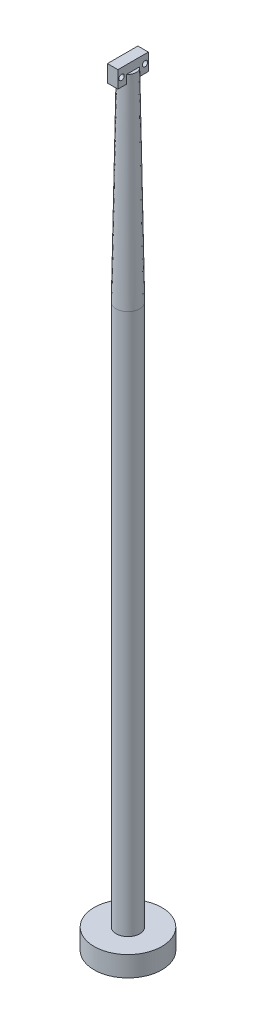
ISO-10303-21;
HEADER;
FILE_DESCRIPTION(('STEP AP214'),'2;1');
FILE_NAME('part.step','',(''),(''),'','','');
FILE_SCHEMA(('AUTOMOTIVE_DESIGN { 1 0 10303 214 1 1 1 1 }'));
ENDSEC;
DATA;
#1=APPLICATION_CONTEXT('core data for automotive mechanical design processes');
#2=APPLICATION_PROTOCOL_DEFINITION('international standard','automotive_design',2000,#1);
#3=PRODUCT_CONTEXT('',#1,'mechanical');
#4=PRODUCT('Part','Part','',(#3));
#5=PRODUCT_RELATED_PRODUCT_CATEGORY('part','',(#4));
#6=PRODUCT_DEFINITION_FORMATION('','',#4);
#7=PRODUCT_DEFINITION_CONTEXT('part definition',#1,'design');
#8=PRODUCT_DEFINITION('design','',#6,#7);
#9=PRODUCT_DEFINITION_SHAPE('','',#8);
#10=(LENGTH_UNIT() NAMED_UNIT(*) SI_UNIT(.MILLI.,.METRE.));
#11=(NAMED_UNIT(*) PLANE_ANGLE_UNIT() SI_UNIT($,.RADIAN.));
#12=(NAMED_UNIT(*) SI_UNIT($,.STERADIAN.) SOLID_ANGLE_UNIT());
#13=UNCERTAINTY_MEASURE_WITH_UNIT(LENGTH_MEASURE(1.E-05),#10,'distance_accuracy_value','');
#14=(GEOMETRIC_REPRESENTATION_CONTEXT(3) GLOBAL_UNCERTAINTY_ASSIGNED_CONTEXT((#13)) GLOBAL_UNIT_ASSIGNED_CONTEXT((#10,
#11,#12)) REPRESENTATION_CONTEXT('',''));
#15=CARTESIAN_POINT('',(0.,0.,0.));
#16=DIRECTION('',(0.,0.,1.));
#17=DIRECTION('',(1.,0.,0.));
#18=AXIS2_PLACEMENT_3D('',#15,#16,#17);
#19=CARTESIAN_POINT('',(0.,11300.,0.));
#20=DIRECTION('',(0.,1.,0.));
#21=DIRECTION('',(0.,0.,1.));
#22=AXIS2_PLACEMENT_3D('',#19,#20,#21);
#23=PLANE('',#22);
#24=CARTESIAN_POINT('',(0.,11300.,0.));
#25=DIRECTION('',(0.,1.,0.));
#26=DIRECTION('',(0.,0.,1.));
#27=AXIS2_PLACEMENT_3D('',#24,#25,#26);
#28=CIRCLE('',#27,122.634805215347);
#29=CARTESIAN_POINT('',(-79.,11300.,-93.7992294755459));
#30=VERTEX_POINT('',#29);
#31=CARTESIAN_POINT('',(-79.,11300.,93.7992294755459));
#32=VERTEX_POINT('',#31);
#33=EDGE_CURVE('E198',#30,#32,#28,.T.);
#34=ORIENTED_EDGE('',*,*,#33,.T.);
#35=DIRECTION('',(0.,0.,-1.));
#36=VECTOR('',#35,1.);
#37=CARTESIAN_POINT('',(-79.,11300.,0.));
#38=LINE('',#37,#36);
#39=EDGE_CURVE('E212',#32,#30,#38,.T.);
#40=ORIENTED_EDGE('',*,*,#39,.T.);
#41=EDGE_LOOP('',(#34,#40));
#42=FACE_BOUND('',#41,.T.);
#43=ADVANCED_FACE('F32',(#42),#23,.T.);
#44=CARTESIAN_POINT('',(0.,300.,0.));
#45=DIRECTION('',(0.,-1.,0.));
#46=DIRECTION('',(0.,0.,-1.));
#47=AXIS2_PLACEMENT_3D('',#44,#45,#46);
#48=CYLINDRICAL_SURFACE('',#47,500.);
#49=CARTESIAN_POINT('',(0.,300.,0.));
#50=DIRECTION('',(0.,1.,0.));
#51=DIRECTION('',(0.,0.,1.));
#52=AXIS2_PLACEMENT_3D('',#49,#50,#51);
#53=CIRCLE('',#52,500.);
#54=CARTESIAN_POINT('',(0.,300.,500.));
#55=VERTEX_POINT('',#54);
#56=EDGE_CURVE('E209',#55,#55,#53,.T.);
#57=ORIENTED_EDGE('',*,*,#56,.F.);
#58=EDGE_LOOP('',(#57));
#59=FACE_BOUND('',#58,.T.);
#60=CARTESIAN_POINT('',(0.,0.,0.));
#61=DIRECTION('',(0.,1.,0.));
#62=DIRECTION('',(0.,0.,1.));
#63=AXIS2_PLACEMENT_3D('',#60,#61,#62);
#64=CIRCLE('',#63,500.);
#65=CARTESIAN_POINT('',(0.,0.,500.));
#66=VERTEX_POINT('',#65);
#67=EDGE_CURVE('E206',#66,#66,#64,.T.);
#68=ORIENTED_EDGE('',*,*,#67,.T.);
#69=EDGE_LOOP('',(#68));
#70=FACE_BOUND('',#69,.T.);
#71=ADVANCED_FACE('F34',(#59,#70),#48,.T.);
#72=CARTESIAN_POINT('',(0.,300.,0.));
#73=DIRECTION('',(0.,1.,0.));
#74=DIRECTION('',(0.,0.,1.));
#75=AXIS2_PLACEMENT_3D('',#72,#73,#74);
#76=PLANE('',#75);
#77=CARTESIAN_POINT('',(0.,300.,0.));
#78=DIRECTION('',(0.,1.,0.));
#79=DIRECTION('',(0.,0.,1.));
#80=AXIS2_PLACEMENT_3D('',#77,#78,#79);
#81=CIRCLE('',#80,175.);
#82=CARTESIAN_POINT('',(0.,300.,175.));
#83=VERTEX_POINT('',#82);
#84=EDGE_CURVE('E202',#83,#83,#81,.T.);
#85=ORIENTED_EDGE('',*,*,#84,.F.);
#86=EDGE_LOOP('',(#85));
#87=FACE_BOUND('',#86,.T.);
#88=ORIENTED_EDGE('',*,*,#56,.T.);
#89=EDGE_LOOP('',(#88));
#90=FACE_BOUND('',#89,.T.);
#91=ADVANCED_FACE('F239',(#87,#90),#76,.T.);
#92=CARTESIAN_POINT('',(0.,0.,0.));
#93=DIRECTION('',(0.,1.,0.));
#94=DIRECTION('',(0.,0.,1.));
#95=AXIS2_PLACEMENT_3D('',#92,#93,#94);
#96=PLANE('',#95);
#97=ORIENTED_EDGE('',*,*,#67,.F.);
#98=EDGE_LOOP('',(#97));
#99=FACE_BOUND('',#98,.T.);
#100=ADVANCED_FACE('F253',(#99),#96,.F.);
#101=CARTESIAN_POINT('',(0.,8300.,0.));
#102=DIRECTION('',(0.,-1.,0.));
#103=DIRECTION('',(0.,0.,-1.));
#104=AXIS2_PLACEMENT_3D('',#101,#102,#103);
#105=CYLINDRICAL_SURFACE('',#104,175.);
#106=CARTESIAN_POINT('',(0.,8300.,0.));
#107=DIRECTION('',(0.,1.,0.));
#108=DIRECTION('',(0.,0.,1.));
#109=AXIS2_PLACEMENT_3D('',#106,#107,#108);
#110=CIRCLE('',#109,175.);
#111=CARTESIAN_POINT('',(0.,8300.,175.));
#112=VERTEX_POINT('',#111);
#113=EDGE_CURVE('E203',#112,#112,#110,.T.);
#114=ORIENTED_EDGE('',*,*,#113,.F.);
#115=EDGE_LOOP('',(#114));
#116=FACE_BOUND('',#115,.T.);
#117=ORIENTED_EDGE('',*,*,#84,.T.);
#118=EDGE_LOOP('',(#117));
#119=FACE_BOUND('',#118,.T.);
#120=ADVANCED_FACE('F249',(#116,#119),#105,.T.);
#121=CARTESIAN_POINT('',(0.,8300.,0.));
#122=DIRECTION('',(0.,-1.,0.));
#123=DIRECTION('',(0.,0.,1.));
#124=AXIS2_PLACEMENT_3D('',#121,#122,#123);
#125=CONICAL_SURFACE('',#124,175.,0.0174532925199434);
#126=CARTESIAN_POINT('',(0.,11175.,0.));
#127=DIRECTION('',(0.,-1.,0.));
#128=DIRECTION('',(0.,0.,-1.));
#129=AXIS2_PLACEMENT_3D('',#126,#127,#128);
#130=CIRCLE('',#129,124.816688331374);
#131=CARTESIAN_POINT('',(-79.,11175.,-96.6343918385797));
#132=VERTEX_POINT('',#131);
#133=CARTESIAN_POINT('',(76.,11175.,-99.0111392016605));
#134=VERTEX_POINT('',#133);
#135=EDGE_CURVE('E11',#132,#134,#130,.T.);
#136=ORIENTED_EDGE('',*,*,#135,.T.);
#137=CARTESIAN_POINT('',(76.,10961.3450010045,-103.672981170937));
#138=CARTESIAN_POINT('',(76.,11002.0524482871,-102.791943214282));
#139=CARTESIAN_POINT('',(76.,11042.7598113228,-101.907006159478));
#140=CARTESIAN_POINT('',(76.,11124.1743498459,-100.128642942186));
#141=CARTESIAN_POINT('',(76.,11164.8815253334,-99.2352167801339));
#142=CARTESIAN_POINT('',(76.,11246.295674207,-97.439184339552));
#143=CARTESIAN_POINT('',(76.,11287.002647593,-96.536578060951));
#144=CARTESIAN_POINT('',(76.,11368.4163732934,-94.7213578878458));
#145=CARTESIAN_POINT('',(76.,11409.1231256078,-93.8087439928269));
#146=CARTESIAN_POINT('',(76.,11449.8297559654,-92.8907125828367));
#147=B_SPLINE_CURVE_WITH_KNOTS('',3,(#137,#138,#139,#140,#141,#142,#143,#144,#145,#146),
.UNSPECIFIED.,.F.,.F.,(4,2,2,2,4),(0.,122.150941188795,244.301876097274,366.452811951517,
488.603754087766),.UNSPECIFIED.);
#148=CARTESIAN_POINT('',(76.,11300.,-96.2460152432615));
#149=VERTEX_POINT('',#148);
#150=EDGE_CURVE('E193',#134,#149,#147,.T.);
#151=ORIENTED_EDGE('',*,*,#150,.T.);
#152=CARTESIAN_POINT('',(76.,11300.,96.2460152432615));
#153=VERTEX_POINT('',#152);
#154=EDGE_CURVE('E199',#153,#149,#28,.T.);
#155=ORIENTED_EDGE('',*,*,#154,.F.);
#156=CARTESIAN_POINT('',(76.,11449.8297559654,92.8907125828367));
#157=CARTESIAN_POINT('',(76.,11409.1231256078,93.8087439928269));
#158=CARTESIAN_POINT('',(76.,11368.4163732934,94.7213578878458));
#159=CARTESIAN_POINT('',(76.,11287.002647593,96.5365780609509));
#160=CARTESIAN_POINT('',(76.,11246.295674207,97.4391843395519));
#161=CARTESIAN_POINT('',(76.,11164.8815253334,99.2352167801339));
#162=CARTESIAN_POINT('',(76.,11124.1743498459,100.128642942186));
#163=CARTESIAN_POINT('',(76.,11042.7598113228,101.907006159478));
#164=CARTESIAN_POINT('',(76.,11002.0524482871,102.791943214282));
#165=CARTESIAN_POINT('',(76.,10961.3450010045,103.672981170937));
#166=B_SPLINE_CURVE_WITH_KNOTS('',3,(#156,#157,#158,#159,#160,#161,#162,#163,#164,#165),
.UNSPECIFIED.,.F.,.F.,(4,2,2,2,4),(0.,122.150942136249,244.30187799049,366.452812898971,
488.603754087766),.UNSPECIFIED.);
#167=CARTESIAN_POINT('',(76.,11175.,99.0111392016606));
#168=VERTEX_POINT('',#167);
#169=EDGE_CURVE('E188',#153,#168,#166,.T.);
#170=ORIENTED_EDGE('',*,*,#169,.T.);
#171=CARTESIAN_POINT('',(-79.,11175.,96.6343918385797));
#172=VERTEX_POINT('',#171);
#173=EDGE_CURVE('E36',#168,#172,#130,.T.);
#174=ORIENTED_EDGE('',*,*,#173,.T.);
#175=CARTESIAN_POINT('',(-79.,11449.773776938,90.3544079248871));
#176=CARTESIAN_POINT('',(-79.,11409.0674225103,91.2982052061098));
#177=CARTESIAN_POINT('',(-79.,11368.3609210498,92.2356471863578));
#178=CARTESIAN_POINT('',(-79.,11286.9476532916,94.0988370728721));
#179=CARTESIAN_POINT('',(-79.,11246.2408869938,95.0245849799531));
#180=CARTESIAN_POINT('',(-79.,11164.8271135668,96.8654033691673));
#181=CARTESIAN_POINT('',(-79.,11124.1201064375,97.7804738514183));
#182=CARTESIAN_POINT('',(-79.,11042.7058693609,99.6007775038031));
#183=CARTESIAN_POINT('',(-79.,11001.9986394135,100.506010673252));
#184=CARTESIAN_POINT('',(-79.,10961.291310123,101.406745173891));
#185=B_SPLINE_CURVE_WITH_KNOTS('',3,(#175,#176,#177,#178,#179,#180,#181,#182,#183,#184),
.UNSPECIFIED.,.F.,.F.,(4,2,2,2,4),(0.,122.151881539936,244.303754570798,366.455626255967,
488.607506447586),.UNSPECIFIED.);
#186=EDGE_CURVE('E147',#32,#172,#185,.T.);
#187=ORIENTED_EDGE('',*,*,#186,.F.);
#188=ORIENTED_EDGE('',*,*,#33,.F.);
#189=CARTESIAN_POINT('',(-79.,10961.291310123,-101.406745173891));
#190=CARTESIAN_POINT('',(-79.,11001.9986394135,-100.506010673252));
#191=CARTESIAN_POINT('',(-79.,11042.7058693609,-99.6007775038031));
#192=CARTESIAN_POINT('',(-79.,11124.1201064375,-97.7804738514182));
#193=CARTESIAN_POINT('',(-79.,11164.8271135668,-96.8654033691673));
#194=CARTESIAN_POINT('',(-79.,11246.2408869938,-95.024584979953));
#195=CARTESIAN_POINT('',(-79.,11286.9476532916,-94.0988370728721));
#196=CARTESIAN_POINT('',(-79.,11368.3609210498,-92.2356471863578));
#197=CARTESIAN_POINT('',(-79.,11409.0674225103,-91.2982052061098));
#198=CARTESIAN_POINT('',(-79.,11449.773776938,-90.3544079248871));
#199=B_SPLINE_CURVE_WITH_KNOTS('',3,(#189,#190,#191,#192,#193,#194,#195,#196,#197,#198),
.UNSPECIFIED.,.F.,.F.,(4,2,2,2,4),(0.,122.151880191622,244.30375187679,366.45562490765,
488.607506447586),.UNSPECIFIED.);
#200=EDGE_CURVE('E47',#132,#30,#199,.T.);
#201=ORIENTED_EDGE('',*,*,#200,.F.);
#202=EDGE_LOOP('',(#136,#151,#155,#170,#174,#187,#188,#201));
#203=FACE_BOUND('',#202,.T.);
#204=ORIENTED_EDGE('',*,*,#113,.T.);
#205=EDGE_LOOP('',(#204));
#206=FACE_BOUND('',#205,.T.);
#207=ADVANCED_FACE('F162',(#203,#206),#125,.T.);
#208=DIRECTION('',(0.,0.,-1.));
#209=VECTOR('',#208,1.);
#210=CARTESIAN_POINT('',(76.,11300.,0.));
#211=LINE('',#210,#209);
#212=EDGE_CURVE('E55',#153,#149,#211,.T.);
#213=ORIENTED_EDGE('',*,*,#212,.F.);
#214=ORIENTED_EDGE('',*,*,#154,.T.);
#215=EDGE_LOOP('',(#213,#214));
#216=FACE_BOUND('',#215,.T.);
#217=ADVANCED_FACE('F235',(#216),#23,.T.);
#218=CARTESIAN_POINT('',(76.,11175.,225.000000000001));
#219=DIRECTION('',(0.,-1.,0.));
#220=DIRECTION('',(0.,0.,-1.));
#221=AXIS2_PLACEMENT_3D('',#218,#219,#220);
#222=PLANE('',#221);
#223=ORIENTED_EDGE('',*,*,#173,.F.);
#224=DIRECTION('',(0.,0.,1.));
#225=VECTOR('',#224,1.);
#226=CARTESIAN_POINT('',(76.,11175.,225.000000000001));
#227=LINE('',#226,#225);
#228=CARTESIAN_POINT('',(76.,11175.,225.000000000001));
#229=VERTEX_POINT('',#228);
#230=EDGE_CURVE('E137',#168,#229,#227,.T.);
#231=ORIENTED_EDGE('',*,*,#230,.T.);
#232=DIRECTION('',(-1.,0.,0.));
#233=VECTOR('',#232,1.);
#234=CARTESIAN_POINT('',(76.,11175.,225.000000000001));
#235=LINE('',#234,#233);
#236=CARTESIAN_POINT('',(-79.,11175.,225.000000000001));
#237=VERTEX_POINT('',#236);
#238=EDGE_CURVE('E108',#229,#237,#235,.T.);
#239=ORIENTED_EDGE('',*,*,#238,.T.);
#240=DIRECTION('',(0.,0.,1.));
#241=VECTOR('',#240,1.);
#242=CARTESIAN_POINT('',(-79.,11175.,225.000000000001));
#243=LINE('',#242,#241);
#244=EDGE_CURVE('E114',#172,#237,#243,.T.);
#245=ORIENTED_EDGE('',*,*,#244,.F.);
#246=EDGE_LOOP('',(#223,#231,#239,#245));
#247=FACE_BOUND('',#246,.T.);
#248=ADVANCED_FACE('F183',(#247),#222,.T.);
#249=CARTESIAN_POINT('',(76.,0.,0.));
#250=DIRECTION('',(1.,0.,0.));
#251=DIRECTION('',(0.,0.,-1.));
#252=AXIS2_PLACEMENT_3D('',#249,#250,#251);
#253=PLANE('',#252);
#254=CARTESIAN_POINT('',(76.,11300.,-176.005281437028));
#255=DIRECTION('',(-1.,0.,0.));
#256=DIRECTION('',(0.,0.,1.));
#257=AXIS2_PLACEMENT_3D('',#254,#255,#256);
#258=CIRCLE('',#257,40.);
#259=CARTESIAN_POINT('',(76.,11300.,-136.005281437028));
#260=VERTEX_POINT('',#259);
#261=EDGE_CURVE('E133',#260,#260,#258,.T.);
#262=ORIENTED_EDGE('',*,*,#261,.T.);
#263=EDGE_LOOP('',(#262));
#264=FACE_BOUND('',#263,.T.);
#265=CARTESIAN_POINT('',(76.,11300.,171.372862680371));
#266=DIRECTION('',(-1.,0.,0.));
#267=DIRECTION('',(0.,0.,1.));
#268=AXIS2_PLACEMENT_3D('',#265,#266,#267);
#269=CIRCLE('',#268,40.);
#270=CARTESIAN_POINT('',(76.,11300.,211.372862680371));
#271=VERTEX_POINT('',#270);
#272=EDGE_CURVE('E130',#271,#271,#269,.T.);
#273=ORIENTED_EDGE('',*,*,#272,.T.);
#274=EDGE_LOOP('',(#273));
#275=FACE_BOUND('',#274,.T.);
#276=ORIENTED_EDGE('',*,*,#150,.F.);
#277=CARTESIAN_POINT('',(76.,11175.,-224.999999999999));
#278=VERTEX_POINT('',#277);
#279=EDGE_CURVE('E138',#278,#134,#227,.T.);
#280=ORIENTED_EDGE('',*,*,#279,.F.);
#281=DIRECTION('',(0.,-1.,0.));
#282=VECTOR('',#281,1.);
#283=CARTESIAN_POINT('',(76.,11425.,-224.999999999999));
#284=LINE('',#283,#282);
#285=CARTESIAN_POINT('',(76.,11425.,-224.999999999999));
#286=VERTEX_POINT('',#285);
#287=EDGE_CURVE('E104',#286,#278,#284,.T.);
#288=ORIENTED_EDGE('',*,*,#287,.F.);
#289=DIRECTION('',(0.,0.,-1.));
#290=VECTOR('',#289,1.);
#291=CARTESIAN_POINT('',(76.,11425.,225.000000000001));
#292=LINE('',#291,#290);
#293=CARTESIAN_POINT('',(76.,11425.,225.000000000001));
#294=VERTEX_POINT('',#293);
#295=EDGE_CURVE('E109',#294,#286,#292,.T.);
#296=ORIENTED_EDGE('',*,*,#295,.F.);
#297=DIRECTION('',(0.,1.,0.));
#298=VECTOR('',#297,1.);
#299=CARTESIAN_POINT('',(76.,11425.,225.000000000001));
#300=LINE('',#299,#298);
#301=EDGE_CURVE('E140',#229,#294,#300,.T.);
#302=ORIENTED_EDGE('',*,*,#301,.F.);
#303=ORIENTED_EDGE('',*,*,#230,.F.);
#304=ORIENTED_EDGE('',*,*,#169,.F.);
#305=ORIENTED_EDGE('',*,*,#212,.T.);
#306=EDGE_LOOP('',(#276,#280,#288,#296,#302,#303,#304,#305));
#307=FACE_BOUND('',#306,.T.);
#308=ADVANCED_FACE('F169',(#264,#275,#307),#253,.T.);
#309=CARTESIAN_POINT('',(-79.,0.,0.));
#310=DIRECTION('',(1.,0.,0.));
#311=DIRECTION('',(0.,0.,-1.));
#312=AXIS2_PLACEMENT_3D('',#309,#310,#311);
#313=PLANE('',#312);
#314=CARTESIAN_POINT('',(-79.,11300.,-176.005281437028));
#315=DIRECTION('',(-1.,0.,0.));
#316=DIRECTION('',(0.,0.,1.));
#317=AXIS2_PLACEMENT_3D('',#314,#315,#316);
#318=CIRCLE('',#317,40.);
#319=CARTESIAN_POINT('',(-79.,11300.,-136.005281437028));
#320=VERTEX_POINT('',#319);
#321=EDGE_CURVE('E121',#320,#320,#318,.T.);
#322=ORIENTED_EDGE('',*,*,#321,.F.);
#323=EDGE_LOOP('',(#322));
#324=FACE_BOUND('',#323,.T.);
#325=CARTESIAN_POINT('',(-79.,11300.,171.372862680371));
#326=DIRECTION('',(-1.,0.,0.));
#327=DIRECTION('',(0.,0.,1.));
#328=AXIS2_PLACEMENT_3D('',#325,#326,#327);
#329=CIRCLE('',#328,40.);
#330=CARTESIAN_POINT('',(-79.,11300.,211.372862680371));
#331=VERTEX_POINT('',#330);
#332=EDGE_CURVE('E124',#331,#331,#329,.T.);
#333=ORIENTED_EDGE('',*,*,#332,.F.);
#334=EDGE_LOOP('',(#333));
#335=FACE_BOUND('',#334,.T.);
#336=CARTESIAN_POINT('',(-79.,11175.,-224.999999999999));
#337=VERTEX_POINT('',#336);
#338=EDGE_CURVE('E111',#337,#132,#243,.T.);
#339=ORIENTED_EDGE('',*,*,#338,.T.);
#340=ORIENTED_EDGE('',*,*,#200,.T.);
#341=ORIENTED_EDGE('',*,*,#39,.F.);
#342=ORIENTED_EDGE('',*,*,#186,.T.);
#343=ORIENTED_EDGE('',*,*,#244,.T.);
#344=DIRECTION('',(0.,1.,0.));
#345=VECTOR('',#344,1.);
#346=CARTESIAN_POINT('',(-79.,11425.,225.000000000001));
#347=LINE('',#346,#345);
#348=CARTESIAN_POINT('',(-79.,11425.,225.000000000001));
#349=VERTEX_POINT('',#348);
#350=EDGE_CURVE('E113',#237,#349,#347,.T.);
#351=ORIENTED_EDGE('',*,*,#350,.T.);
#352=DIRECTION('',(0.,0.,-1.));
#353=VECTOR('',#352,1.);
#354=CARTESIAN_POINT('',(-79.,11425.,225.000000000001));
#355=LINE('',#354,#353);
#356=CARTESIAN_POINT('',(-79.,11425.,-224.999999999999));
#357=VERTEX_POINT('',#356);
#358=EDGE_CURVE('E120',#349,#357,#355,.T.);
#359=ORIENTED_EDGE('',*,*,#358,.T.);
#360=DIRECTION('',(0.,-1.,0.));
#361=VECTOR('',#360,1.);
#362=CARTESIAN_POINT('',(-79.,11425.,-224.999999999999));
#363=LINE('',#362,#361);
#364=EDGE_CURVE('E102',#357,#337,#363,.T.);
#365=ORIENTED_EDGE('',*,*,#364,.T.);
#366=EDGE_LOOP('',(#339,#340,#341,#342,#343,#351,#359,#365));
#367=FACE_BOUND('',#366,.T.);
#368=ADVANCED_FACE('F117',(#324,#335,#367),#313,.F.);
#369=CARTESIAN_POINT('',(76.,11425.,-224.999999999999));
#370=DIRECTION('',(0.,0.,-1.));
#371=DIRECTION('',(0.,1.,0.));
#372=AXIS2_PLACEMENT_3D('',#369,#370,#371);
#373=PLANE('',#372);
#374=DIRECTION('',(-1.,0.,0.));
#375=VECTOR('',#374,1.);
#376=CARTESIAN_POINT('',(76.,11175.,-224.999999999999));
#377=LINE('',#376,#375);
#378=EDGE_CURVE('E98',#278,#337,#377,.T.);
#379=ORIENTED_EDGE('',*,*,#378,.T.);
#380=ORIENTED_EDGE('',*,*,#364,.F.);
#381=DIRECTION('',(-1.,0.,0.));
#382=VECTOR('',#381,1.);
#383=CARTESIAN_POINT('',(76.,11425.,-224.999999999999));
#384=LINE('',#383,#382);
#385=EDGE_CURVE('E145',#286,#357,#384,.T.);
#386=ORIENTED_EDGE('',*,*,#385,.F.);
#387=ORIENTED_EDGE('',*,*,#287,.T.);
#388=EDGE_LOOP('',(#379,#380,#386,#387));
#389=FACE_BOUND('',#388,.T.);
#390=ADVANCED_FACE('F100',(#389),#373,.T.);
#391=CARTESIAN_POINT('',(76.,11425.,225.000000000001));
#392=DIRECTION('',(0.,1.,0.));
#393=DIRECTION('',(0.,0.,1.));
#394=AXIS2_PLACEMENT_3D('',#391,#392,#393);
#395=PLANE('',#394);
#396=ORIENTED_EDGE('',*,*,#385,.T.);
#397=ORIENTED_EDGE('',*,*,#358,.F.);
#398=DIRECTION('',(-1.,0.,0.));
#399=VECTOR('',#398,1.);
#400=CARTESIAN_POINT('',(76.,11425.,225.000000000001));
#401=LINE('',#400,#399);
#402=EDGE_CURVE('E148',#294,#349,#401,.T.);
#403=ORIENTED_EDGE('',*,*,#402,.F.);
#404=ORIENTED_EDGE('',*,*,#295,.T.);
#405=EDGE_LOOP('',(#396,#397,#403,#404));
#406=FACE_BOUND('',#405,.T.);
#407=ADVANCED_FACE('F185',(#406),#395,.T.);
#408=CARTESIAN_POINT('',(76.,11425.,225.000000000001));
#409=DIRECTION('',(0.,0.,1.));
#410=DIRECTION('',(0.,-1.,0.));
#411=AXIS2_PLACEMENT_3D('',#408,#409,#410);
#412=PLANE('',#411);
#413=ORIENTED_EDGE('',*,*,#402,.T.);
#414=ORIENTED_EDGE('',*,*,#350,.F.);
#415=ORIENTED_EDGE('',*,*,#238,.F.);
#416=ORIENTED_EDGE('',*,*,#301,.T.);
#417=EDGE_LOOP('',(#413,#414,#415,#416));
#418=FACE_BOUND('',#417,.T.);
#419=ADVANCED_FACE('F230',(#418),#412,.T.);
#420=ORIENTED_EDGE('',*,*,#135,.F.);
#421=ORIENTED_EDGE('',*,*,#338,.F.);
#422=ORIENTED_EDGE('',*,*,#378,.F.);
#423=ORIENTED_EDGE('',*,*,#279,.T.);
#424=EDGE_LOOP('',(#420,#421,#422,#423));
#425=FACE_BOUND('',#424,.T.);
#426=ADVANCED_FACE('F112',(#425),#222,.T.);
#427=CARTESIAN_POINT('',(76.,11300.,-176.005281437028));
#428=DIRECTION('',(-1.,0.,0.));
#429=DIRECTION('',(0.,0.,1.));
#430=AXIS2_PLACEMENT_3D('',#427,#428,#429);
#431=CYLINDRICAL_SURFACE('',#430,40.);
#432=ORIENTED_EDGE('',*,*,#261,.F.);
#433=EDGE_LOOP('',(#432));
#434=FACE_BOUND('',#433,.T.);
#435=ORIENTED_EDGE('',*,*,#321,.T.);
#436=EDGE_LOOP('',(#435));
#437=FACE_BOUND('',#436,.T.);
#438=ADVANCED_FACE('F175',(#434,#437),#431,.F.);
#439=CARTESIAN_POINT('',(76.,11300.,171.372862680371));
#440=DIRECTION('',(-1.,0.,0.));
#441=DIRECTION('',(0.,0.,1.));
#442=AXIS2_PLACEMENT_3D('',#439,#440,#441);
#443=CYLINDRICAL_SURFACE('',#442,40.);
#444=ORIENTED_EDGE('',*,*,#272,.F.);
#445=EDGE_LOOP('',(#444));
#446=FACE_BOUND('',#445,.T.);
#447=ORIENTED_EDGE('',*,*,#332,.T.);
#448=EDGE_LOOP('',(#447));
#449=FACE_BOUND('',#448,.T.);
#450=ADVANCED_FACE('F171',(#446,#449),#443,.F.);
#451=CLOSED_SHELL('',(#43,#71,#91,#100,#120,#207,#217,#248,#308,#368,#390,#407,#419,#426,#438,#450));
#452=MANIFOLD_SOLID_BREP('B2',#451);
#453=ADVANCED_BREP_SHAPE_REPRESENTATION('',(#18,#452),#14);
#454=SHAPE_DEFINITION_REPRESENTATION(#9,#453);
ENDSEC;
END-ISO-10303-21;
